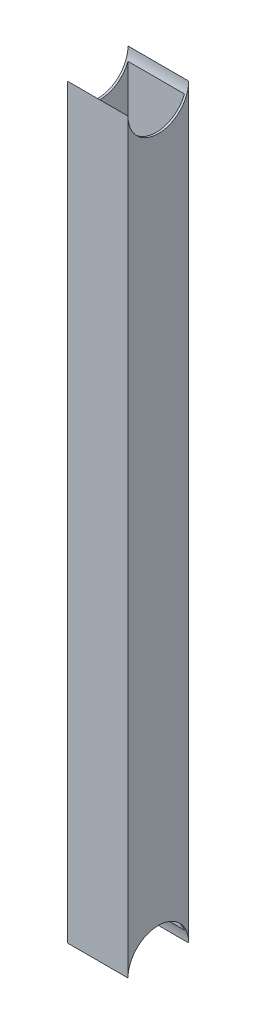
ISO-10303-21;
HEADER;
FILE_DESCRIPTION(('STEP AP214'),'2;1');
FILE_NAME('part.step','',(''),(''),'','','');
FILE_SCHEMA(('AUTOMOTIVE_DESIGN { 1 0 10303 214 1 1 1 1 }'));
ENDSEC;
DATA;
#1=APPLICATION_CONTEXT('core data for automotive mechanical design processes');
#2=APPLICATION_PROTOCOL_DEFINITION('international standard','automotive_design',2000,#1);
#3=PRODUCT_CONTEXT('',#1,'mechanical');
#4=PRODUCT('Part','Part','',(#3));
#5=PRODUCT_RELATED_PRODUCT_CATEGORY('part','',(#4));
#6=PRODUCT_DEFINITION_FORMATION('','',#4);
#7=PRODUCT_DEFINITION_CONTEXT('part definition',#1,'design');
#8=PRODUCT_DEFINITION('design','',#6,#7);
#9=PRODUCT_DEFINITION_SHAPE('','',#8);
#10=(LENGTH_UNIT() NAMED_UNIT(*) SI_UNIT(.MILLI.,.METRE.));
#11=(NAMED_UNIT(*) PLANE_ANGLE_UNIT() SI_UNIT($,.RADIAN.));
#12=(NAMED_UNIT(*) SI_UNIT($,.STERADIAN.) SOLID_ANGLE_UNIT());
#13=UNCERTAINTY_MEASURE_WITH_UNIT(LENGTH_MEASURE(1.E-05),#10,'distance_accuracy_value','');
#14=(GEOMETRIC_REPRESENTATION_CONTEXT(3) GLOBAL_UNCERTAINTY_ASSIGNED_CONTEXT((#13)) GLOBAL_UNIT_ASSIGNED_CONTEXT((#10,
#11,#12)) REPRESENTATION_CONTEXT('',''));
#15=CARTESIAN_POINT('',(0.,0.,0.));
#16=DIRECTION('',(0.,0.,1.));
#17=DIRECTION('',(1.,0.,0.));
#18=AXIS2_PLACEMENT_3D('',#15,#16,#17);
#19=CARTESIAN_POINT('',(12.7,594.406898796156,-227.828255033388));
#20=DIRECTION('',(0.,0.,-1.));
#21=DIRECTION('',(0.,1.,0.));
#22=AXIS2_PLACEMENT_3D('',#19,#20,#21);
#23=PLANE('',#22);
#24=DIRECTION('',(1.,0.,0.));
#25=VECTOR('',#24,1.);
#26=CARTESIAN_POINT('',(-161.277565884108,594.406898796156,-227.828255033388));
#27=LINE('',#26,#25);
#28=CARTESIAN_POINT('',(12.7,594.406898796156,-227.828255033388));
#29=VERTEX_POINT('',#28);
#30=CARTESIAN_POINT('',(-12.7,594.406898796156,-227.828255033388));
#31=VERTEX_POINT('',#30);
#32=EDGE_CURVE('E144',#29,#31,#27,.F.);
#33=ORIENTED_EDGE('',*,*,#32,.F.);
#34=DIRECTION('',(0.,1.,0.));
#35=VECTOR('',#34,1.);
#36=CARTESIAN_POINT('',(12.7,594.406898796156,-227.828255033388));
#37=LINE('',#36,#35);
#38=CARTESIAN_POINT('',(12.7,906.682621170106,-227.828255033388));
#39=VERTEX_POINT('',#38);
#40=EDGE_CURVE('E47',#29,#39,#37,.T.);
#41=ORIENTED_EDGE('',*,*,#40,.T.);
#42=DIRECTION('',(1.,0.,0.));
#43=VECTOR('',#42,1.);
#44=CARTESIAN_POINT('',(-58.2458240595561,906.682621170106,-227.828255033388));
#45=LINE('',#44,#43);
#46=CARTESIAN_POINT('',(-12.7,906.682621170106,-227.828255033388));
#47=VERTEX_POINT('',#46);
#48=EDGE_CURVE('E157',#39,#47,#45,.F.);
#49=ORIENTED_EDGE('',*,*,#48,.T.);
#50=DIRECTION('',(0.,1.,0.));
#51=VECTOR('',#50,1.);
#52=CARTESIAN_POINT('',(-12.7,594.406898796156,-227.828255033388));
#53=LINE('',#52,#51);
#54=EDGE_CURVE('E146',#31,#47,#53,.T.);
#55=ORIENTED_EDGE('',*,*,#54,.F.);
#56=EDGE_LOOP('',(#33,#41,#49,#55));
#57=FACE_BOUND('',#56,.T.);
#58=ADVANCED_FACE('F43',(#57),#23,.F.);
#59=CARTESIAN_POINT('',(12.7,594.406898796156,-253.228255033388));
#60=DIRECTION('',(-1.,0.,0.));
#61=DIRECTION('',(0.,-1.,0.));
#62=AXIS2_PLACEMENT_3D('',#59,#60,#61);
#63=PLANE('',#62);
#64=CARTESIAN_POINT('',(12.7,594.406898796156,-240.528255033388));
#65=DIRECTION('',(-1.,0.,0.));
#66=DIRECTION('',(0.,-1.,0.));
#67=AXIS2_PLACEMENT_3D('',#64,#65,#66);
#68=CIRCLE('',#67,12.7);
#69=CARTESIAN_POINT('',(12.7,594.406898796156,-253.228255033388));
#70=VERTEX_POINT('',#69);
#71=EDGE_CURVE('E141',#70,#29,#68,.F.);
#72=ORIENTED_EDGE('',*,*,#71,.F.);
#73=DIRECTION('',(0.,1.,0.));
#74=VECTOR('',#73,1.);
#75=CARTESIAN_POINT('',(12.7,594.406898796156,-253.228255033388));
#76=LINE('',#75,#74);
#77=CARTESIAN_POINT('',(12.7,906.682621170106,-253.228255033388));
#78=VERTEX_POINT('',#77);
#79=EDGE_CURVE('E154',#70,#78,#76,.T.);
#80=ORIENTED_EDGE('',*,*,#79,.T.);
#81=CARTESIAN_POINT('',(12.7,906.682621170106,-240.528255033388));
#82=DIRECTION('',(-1.,0.,0.));
#83=DIRECTION('',(0.,-1.,0.));
#84=AXIS2_PLACEMENT_3D('',#81,#82,#83);
#85=CIRCLE('',#84,12.7);
#86=EDGE_CURVE('E145',#39,#78,#85,.F.);
#87=ORIENTED_EDGE('',*,*,#86,.F.);
#88=ORIENTED_EDGE('',*,*,#40,.F.);
#89=EDGE_LOOP('',(#72,#80,#87,#88));
#90=FACE_BOUND('',#89,.T.);
#91=ADVANCED_FACE('F217',(#90),#63,.F.);
#92=CARTESIAN_POINT('',(12.7,594.406898796156,-253.228255033388));
#93=DIRECTION('',(0.,0.,1.));
#94=DIRECTION('',(0.,-1.,0.));
#95=AXIS2_PLACEMENT_3D('',#92,#93,#94);
#96=PLANE('',#95);
#97=ORIENTED_EDGE('',*,*,#79,.F.);
#98=DIRECTION('',(1.,0.,0.));
#99=VECTOR('',#98,1.);
#100=CARTESIAN_POINT('',(-161.277565884108,594.406898796156,-253.228255033388));
#101=LINE('',#100,#99);
#102=CARTESIAN_POINT('',(-12.7,594.406898796156,-253.228255033388));
#103=VERTEX_POINT('',#102);
#104=EDGE_CURVE('E63',#70,#103,#101,.F.);
#105=ORIENTED_EDGE('',*,*,#104,.T.);
#106=DIRECTION('',(0.,1.,0.));
#107=VECTOR('',#106,1.);
#108=CARTESIAN_POINT('',(-12.7,594.406898796156,-253.228255033388));
#109=LINE('',#108,#107);
#110=CARTESIAN_POINT('',(-12.7,906.682621170106,-253.228255033388));
#111=VERTEX_POINT('',#110);
#112=EDGE_CURVE('E151',#103,#111,#109,.T.);
#113=ORIENTED_EDGE('',*,*,#112,.T.);
#114=DIRECTION('',(1.,0.,0.));
#115=VECTOR('',#114,1.);
#116=CARTESIAN_POINT('',(-58.2458240595561,906.682621170106,-253.228255033388));
#117=LINE('',#116,#115);
#118=EDGE_CURVE('E150',#78,#111,#117,.F.);
#119=ORIENTED_EDGE('',*,*,#118,.F.);
#120=EDGE_LOOP('',(#97,#105,#113,#119));
#121=FACE_BOUND('',#120,.T.);
#122=ADVANCED_FACE('F216',(#121),#96,.F.);
#123=CARTESIAN_POINT('',(-12.7,594.406898796156,-253.228255033388));
#124=DIRECTION('',(1.,0.,0.));
#125=DIRECTION('',(0.,1.,0.));
#126=AXIS2_PLACEMENT_3D('',#123,#124,#125);
#127=PLANE('',#126);
#128=CARTESIAN_POINT('',(-12.7,594.406898796156,-240.528255033388));
#129=DIRECTION('',(1.,0.,0.));
#130=DIRECTION('',(0.,1.,0.));
#131=AXIS2_PLACEMENT_3D('',#128,#129,#130);
#132=CIRCLE('',#131,12.7);
#133=EDGE_CURVE('E136',#31,#103,#132,.F.);
#134=ORIENTED_EDGE('',*,*,#133,.F.);
#135=ORIENTED_EDGE('',*,*,#54,.T.);
#136=CARTESIAN_POINT('',(-12.7,906.682621170106,-240.528255033388));
#137=DIRECTION('',(1.,0.,0.));
#138=DIRECTION('',(0.,1.,0.));
#139=AXIS2_PLACEMENT_3D('',#136,#137,#138);
#140=CIRCLE('',#139,12.7);
#141=EDGE_CURVE('E175',#111,#47,#140,.F.);
#142=ORIENTED_EDGE('',*,*,#141,.F.);
#143=ORIENTED_EDGE('',*,*,#112,.F.);
#144=EDGE_LOOP('',(#134,#135,#142,#143));
#145=FACE_BOUND('',#144,.T.);
#146=ADVANCED_FACE('F213',(#145),#127,.F.);
#147=CARTESIAN_POINT('',(-58.2458240595561,906.682621170106,-240.528255033388));
#148=DIRECTION('',(1.,0.,0.));
#149=DIRECTION('',(0.,1.,0.));
#150=AXIS2_PLACEMENT_3D('',#147,#148,#149);
#151=CYLINDRICAL_SURFACE('',#150,12.7);
#152=DIRECTION('',(1.,0.,0.));
#153=VECTOR('',#152,1.);
#154=CARTESIAN_POINT('',(-58.2458240595561,902.014615278935,-252.339255033388));
#155=LINE('',#154,#153);
#156=CARTESIAN_POINT('',(11.811,902.014615278935,-252.339255033388));
#157=VERTEX_POINT('',#156);
#158=CARTESIAN_POINT('',(-11.811,902.014615278935,-252.339255033388));
#159=VERTEX_POINT('',#158);
#160=EDGE_CURVE('E105',#157,#159,#155,.F.);
#161=ORIENTED_EDGE('',*,*,#160,.F.);
#162=CARTESIAN_POINT('',(11.811,906.682621170106,-240.528255033388));
#163=DIRECTION('',(-1.,0.,0.));
#164=DIRECTION('',(0.,-1.,0.));
#165=AXIS2_PLACEMENT_3D('',#162,#163,#164);
#166=CIRCLE('',#165,12.7);
#167=CARTESIAN_POINT('',(11.811,902.014615278936,-228.717255033388));
#168=VERTEX_POINT('',#167);
#169=EDGE_CURVE('E109',#168,#157,#166,.F.);
#170=ORIENTED_EDGE('',*,*,#169,.F.);
#171=DIRECTION('',(1.,0.,0.));
#172=VECTOR('',#171,1.);
#173=CARTESIAN_POINT('',(-58.2458240595561,902.014615278936,-228.717255033388));
#174=LINE('',#173,#172);
#175=CARTESIAN_POINT('',(-11.811,902.014615278936,-228.717255033388));
#176=VERTEX_POINT('',#175);
#177=EDGE_CURVE('E187',#176,#168,#174,.T.);
#178=ORIENTED_EDGE('',*,*,#177,.F.);
#179=CARTESIAN_POINT('',(-11.811,906.682621170106,-240.528255033388));
#180=DIRECTION('',(1.,0.,0.));
#181=DIRECTION('',(0.,1.,0.));
#182=AXIS2_PLACEMENT_3D('',#179,#180,#181);
#183=CIRCLE('',#182,12.7);
#184=EDGE_CURVE('E11',#159,#176,#183,.F.);
#185=ORIENTED_EDGE('',*,*,#184,.F.);
#186=EDGE_LOOP('',(#161,#170,#178,#185));
#187=FACE_BOUND('',#186,.T.);
#188=ORIENTED_EDGE('',*,*,#118,.T.);
#189=ORIENTED_EDGE('',*,*,#141,.T.);
#190=ORIENTED_EDGE('',*,*,#48,.F.);
#191=ORIENTED_EDGE('',*,*,#86,.T.);
#192=EDGE_LOOP('',(#188,#189,#190,#191));
#193=FACE_BOUND('',#192,.T.);
#194=ADVANCED_FACE('F107',(#187,#193),#151,.F.);
#195=CARTESIAN_POINT('',(-161.277565884108,594.406898796156,-240.528255033388));
#196=DIRECTION('',(1.,0.,0.));
#197=DIRECTION('',(0.,0.,-1.));
#198=AXIS2_PLACEMENT_3D('',#195,#196,#197);
#199=CYLINDRICAL_SURFACE('',#198,12.7);
#200=DIRECTION('',(1.,0.,0.));
#201=VECTOR('',#200,1.);
#202=CARTESIAN_POINT('',(-161.277565884108,599.074904687326,-228.717255033388));
#203=LINE('',#202,#201);
#204=CARTESIAN_POINT('',(11.811,599.074904687326,-228.717255033388));
#205=VERTEX_POINT('',#204);
#206=CARTESIAN_POINT('',(-11.811,599.074904687326,-228.717255033388));
#207=VERTEX_POINT('',#206);
#208=EDGE_CURVE('E127',#205,#207,#203,.F.);
#209=ORIENTED_EDGE('',*,*,#208,.F.);
#210=CARTESIAN_POINT('',(11.811,594.406898796156,-240.528255033388));
#211=DIRECTION('',(-1.,0.,0.));
#212=DIRECTION('',(0.,-1.,0.));
#213=AXIS2_PLACEMENT_3D('',#210,#211,#212);
#214=CIRCLE('',#213,12.7);
#215=CARTESIAN_POINT('',(11.811,599.074904687327,-252.339255033388));
#216=VERTEX_POINT('',#215);
#217=EDGE_CURVE('E116',#216,#205,#214,.F.);
#218=ORIENTED_EDGE('',*,*,#217,.F.);
#219=DIRECTION('',(1.,0.,0.));
#220=VECTOR('',#219,1.);
#221=CARTESIAN_POINT('',(-161.277565884108,599.074904687327,-252.339255033388));
#222=LINE('',#221,#220);
#223=CARTESIAN_POINT('',(-11.811,599.074904687327,-252.339255033388));
#224=VERTEX_POINT('',#223);
#225=EDGE_CURVE('E131',#224,#216,#222,.T.);
#226=ORIENTED_EDGE('',*,*,#225,.F.);
#227=CARTESIAN_POINT('',(-11.811,594.406898796156,-240.528255033388));
#228=DIRECTION('',(1.,0.,0.));
#229=DIRECTION('',(0.,1.,0.));
#230=AXIS2_PLACEMENT_3D('',#227,#228,#229);
#231=CIRCLE('',#230,12.7);
#232=EDGE_CURVE('E183',#207,#224,#231,.F.);
#233=ORIENTED_EDGE('',*,*,#232,.F.);
#234=EDGE_LOOP('',(#209,#218,#226,#233));
#235=FACE_BOUND('',#234,.T.);
#236=ORIENTED_EDGE('',*,*,#71,.T.);
#237=ORIENTED_EDGE('',*,*,#32,.T.);
#238=ORIENTED_EDGE('',*,*,#133,.T.);
#239=ORIENTED_EDGE('',*,*,#104,.F.);
#240=EDGE_LOOP('',(#236,#237,#238,#239));
#241=FACE_BOUND('',#240,.T.);
#242=ADVANCED_FACE('F208',(#235,#241),#199,.F.);
#243=CARTESIAN_POINT('',(11.811,594.406898796156,-252.339255033388));
#244=DIRECTION('',(0.,0.,1.));
#245=DIRECTION('',(0.,-1.,0.));
#246=AXIS2_PLACEMENT_3D('',#243,#244,#245);
#247=PLANE('',#246);
#248=DIRECTION('',(0.,1.,0.));
#249=VECTOR('',#248,1.);
#250=CARTESIAN_POINT('',(-11.811,594.406898796156,-252.339255033388));
#251=LINE('',#250,#249);
#252=EDGE_CURVE('E54',#224,#159,#251,.T.);
#253=ORIENTED_EDGE('',*,*,#252,.F.);
#254=ORIENTED_EDGE('',*,*,#225,.T.);
#255=DIRECTION('',(0.,1.,0.));
#256=VECTOR('',#255,1.);
#257=CARTESIAN_POINT('',(11.811,594.406898796156,-252.339255033388));
#258=LINE('',#257,#256);
#259=EDGE_CURVE('E117',#216,#157,#258,.T.);
#260=ORIENTED_EDGE('',*,*,#259,.T.);
#261=ORIENTED_EDGE('',*,*,#160,.T.);
#262=EDGE_LOOP('',(#253,#254,#260,#261));
#263=FACE_BOUND('',#262,.T.);
#264=ADVANCED_FACE('F130',(#263),#247,.T.);
#265=CARTESIAN_POINT('',(11.811,594.406898796156,-252.339255033388));
#266=DIRECTION('',(-1.,0.,0.));
#267=DIRECTION('',(0.,-1.,0.));
#268=AXIS2_PLACEMENT_3D('',#265,#266,#267);
#269=PLANE('',#268);
#270=ORIENTED_EDGE('',*,*,#259,.F.);
#271=ORIENTED_EDGE('',*,*,#217,.T.);
#272=DIRECTION('',(0.,1.,0.));
#273=VECTOR('',#272,1.);
#274=CARTESIAN_POINT('',(11.811,594.406898796156,-228.717255033388));
#275=LINE('',#274,#273);
#276=EDGE_CURVE('E125',#205,#168,#275,.T.);
#277=ORIENTED_EDGE('',*,*,#276,.T.);
#278=ORIENTED_EDGE('',*,*,#169,.T.);
#279=EDGE_LOOP('',(#270,#271,#277,#278));
#280=FACE_BOUND('',#279,.T.);
#281=ADVANCED_FACE('F122',(#280),#269,.T.);
#282=CARTESIAN_POINT('',(11.811,594.406898796156,-228.717255033388));
#283=DIRECTION('',(0.,0.,-1.));
#284=DIRECTION('',(0.,1.,0.));
#285=AXIS2_PLACEMENT_3D('',#282,#283,#284);
#286=PLANE('',#285);
#287=ORIENTED_EDGE('',*,*,#276,.F.);
#288=ORIENTED_EDGE('',*,*,#208,.T.);
#289=DIRECTION('',(0.,1.,0.));
#290=VECTOR('',#289,1.);
#291=CARTESIAN_POINT('',(-11.811,594.406898796156,-228.717255033388));
#292=LINE('',#291,#290);
#293=EDGE_CURVE('E184',#207,#176,#292,.T.);
#294=ORIENTED_EDGE('',*,*,#293,.T.);
#295=ORIENTED_EDGE('',*,*,#177,.T.);
#296=EDGE_LOOP('',(#287,#288,#294,#295));
#297=FACE_BOUND('',#296,.T.);
#298=ADVANCED_FACE('F239',(#297),#286,.T.);
#299=CARTESIAN_POINT('',(-11.811,594.406898796156,-252.339255033388));
#300=DIRECTION('',(1.,0.,0.));
#301=DIRECTION('',(0.,1.,0.));
#302=AXIS2_PLACEMENT_3D('',#299,#300,#301);
#303=PLANE('',#302);
#304=ORIENTED_EDGE('',*,*,#293,.F.);
#305=ORIENTED_EDGE('',*,*,#232,.T.);
#306=ORIENTED_EDGE('',*,*,#252,.T.);
#307=ORIENTED_EDGE('',*,*,#184,.T.);
#308=EDGE_LOOP('',(#304,#305,#306,#307));
#309=FACE_BOUND('',#308,.T.);
#310=ADVANCED_FACE('F45',(#309),#303,.T.);
#311=CLOSED_SHELL('',(#58,#91,#122,#146,#194,#242,#264,#281,#298,#310));
#312=MANIFOLD_SOLID_BREP('B2',#311);
#313=ADVANCED_BREP_SHAPE_REPRESENTATION('',(#18,#312),#14);
#314=SHAPE_DEFINITION_REPRESENTATION(#9,#313);
ENDSEC;
END-ISO-10303-21;
